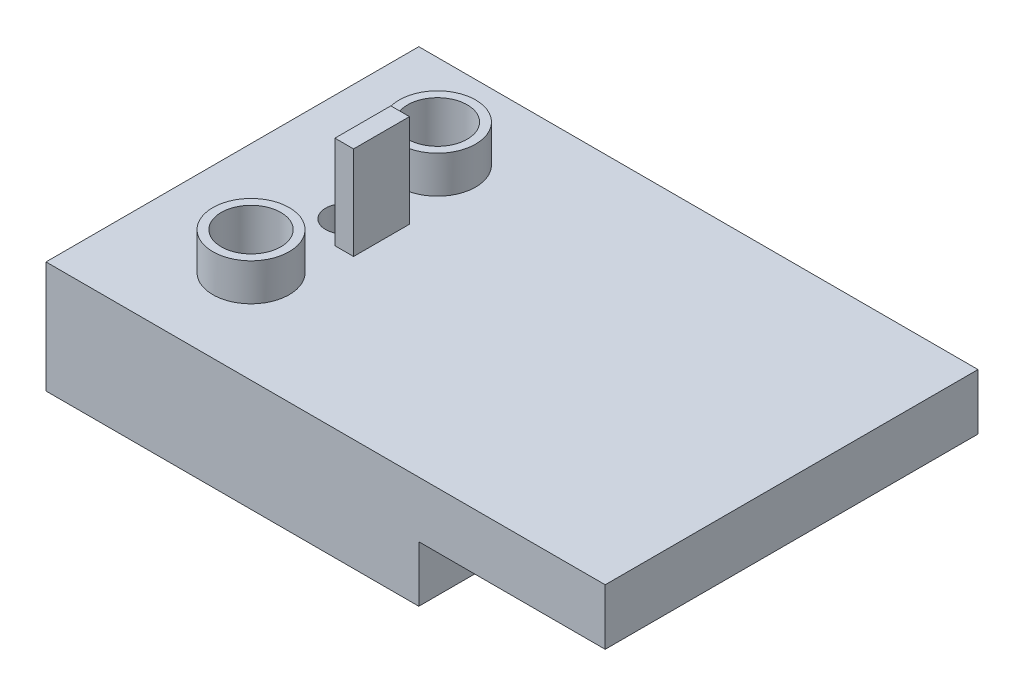
ISO-10303-21;
HEADER;
FILE_DESCRIPTION(('STEP AP214'),'2;1');
FILE_NAME('part.step','',(''),(''),'','','');
FILE_SCHEMA(('AUTOMOTIVE_DESIGN { 1 0 10303 214 1 1 1 1 }'));
ENDSEC;
DATA;
#1=APPLICATION_CONTEXT('core data for automotive mechanical design processes');
#2=APPLICATION_PROTOCOL_DEFINITION('international standard','automotive_design',2000,#1);
#3=PRODUCT_CONTEXT('',#1,'mechanical');
#4=PRODUCT('Part','Part','',(#3));
#5=PRODUCT_RELATED_PRODUCT_CATEGORY('part','',(#4));
#6=PRODUCT_DEFINITION_FORMATION('','',#4);
#7=PRODUCT_DEFINITION_CONTEXT('part definition',#1,'design');
#8=PRODUCT_DEFINITION('design','',#6,#7);
#9=PRODUCT_DEFINITION_SHAPE('','',#8);
#10=(LENGTH_UNIT() NAMED_UNIT(*) SI_UNIT(.MILLI.,.METRE.));
#11=(NAMED_UNIT(*) PLANE_ANGLE_UNIT() SI_UNIT($,.RADIAN.));
#12=(NAMED_UNIT(*) SI_UNIT($,.STERADIAN.) SOLID_ANGLE_UNIT());
#13=UNCERTAINTY_MEASURE_WITH_UNIT(LENGTH_MEASURE(1.E-05),#10,'distance_accuracy_value','');
#14=(GEOMETRIC_REPRESENTATION_CONTEXT(3) GLOBAL_UNCERTAINTY_ASSIGNED_CONTEXT((#13)) GLOBAL_UNIT_ASSIGNED_CONTEXT((#10,
#11,#12)) REPRESENTATION_CONTEXT('',''));
#15=CARTESIAN_POINT('',(0.,0.,0.));
#16=DIRECTION('',(0.,0.,1.));
#17=DIRECTION('',(1.,0.,0.));
#18=AXIS2_PLACEMENT_3D('',#15,#16,#17);
#19=CARTESIAN_POINT('',(0.,6.,0.));
#20=DIRECTION('',(0.,-1.,0.));
#21=DIRECTION('',(0.,0.,-1.));
#22=AXIS2_PLACEMENT_3D('',#19,#20,#21);
#23=PLANE('',#22);
#24=CARTESIAN_POINT('',(6.,6.,-5.));
#25=DIRECTION('',(0.,-1.,0.));
#26=DIRECTION('',(0.,0.,-1.));
#27=AXIS2_PLACEMENT_3D('',#24,#25,#26);
#28=CIRCLE('',#27,2.05);
#29=CARTESIAN_POINT('',(6.,6.,-7.05));
#30=VERTEX_POINT('',#29);
#31=EDGE_CURVE('E370',#30,#30,#28,.F.);
#32=ORIENTED_EDGE('',*,*,#31,.F.);
#33=EDGE_LOOP('',(#32));
#34=FACE_BOUND('',#33,.T.);
#35=DIRECTION('',(0.,0.,1.));
#36=VECTOR('',#35,1.);
#37=CARTESIAN_POINT('',(0.,6.,0.));
#38=LINE('',#37,#36);
#39=CARTESIAN_POINT('',(0.,6.,-20.));
#40=VERTEX_POINT('',#39);
#41=CARTESIAN_POINT('',(0.,6.,0.));
#42=VERTEX_POINT('',#41);
#43=EDGE_CURVE('E339',#40,#42,#38,.T.);
#44=ORIENTED_EDGE('',*,*,#43,.T.);
#45=DIRECTION('',(1.,0.,0.));
#46=VECTOR('',#45,1.);
#47=CARTESIAN_POINT('',(0.,6.,0.));
#48=LINE('',#47,#46);
#49=CARTESIAN_POINT('',(30.,6.,0.));
#50=VERTEX_POINT('',#49);
#51=EDGE_CURVE('E342',#42,#50,#48,.T.);
#52=ORIENTED_EDGE('',*,*,#51,.T.);
#53=DIRECTION('',(0.,0.,-1.));
#54=VECTOR('',#53,1.);
#55=CARTESIAN_POINT('',(30.,6.,0.));
#56=LINE('',#55,#54);
#57=CARTESIAN_POINT('',(30.,6.,-20.));
#58=VERTEX_POINT('',#57);
#59=EDGE_CURVE('E345',#50,#58,#56,.T.);
#60=ORIENTED_EDGE('',*,*,#59,.T.);
#61=DIRECTION('',(-1.,0.,0.));
#62=VECTOR('',#61,1.);
#63=CARTESIAN_POINT('',(0.,6.,-20.));
#64=LINE('',#63,#62);
#65=EDGE_CURVE('E347',#58,#40,#64,.T.);
#66=ORIENTED_EDGE('',*,*,#65,.T.);
#67=EDGE_LOOP('',(#44,#52,#60,#66));
#68=FACE_BOUND('',#67,.T.);
#69=CARTESIAN_POINT('',(6.,6.,-15.));
#70=DIRECTION('',(0.,-1.,0.));
#71=DIRECTION('',(0.,0.,-1.));
#72=AXIS2_PLACEMENT_3D('',#69,#70,#71);
#73=CIRCLE('',#72,2.05);
#74=CARTESIAN_POINT('',(6.,6.,-17.05));
#75=VERTEX_POINT('',#74);
#76=EDGE_CURVE('E367',#75,#75,#73,.F.);
#77=ORIENTED_EDGE('',*,*,#76,.F.);
#78=EDGE_LOOP('',(#77));
#79=FACE_BOUND('',#78,.T.);
#80=DIRECTION('',(0.,0.,1.));
#81=VECTOR('',#80,1.);
#82=CARTESIAN_POINT('',(7.,6.,-8.5));
#83=LINE('',#82,#81);
#84=CARTESIAN_POINT('',(7.,6.,-11.5));
#85=VERTEX_POINT('',#84);
#86=CARTESIAN_POINT('',(7.,6.,-10.));
#87=VERTEX_POINT('',#86);
#88=EDGE_CURVE('E742',#85,#87,#83,.T.);
#89=ORIENTED_EDGE('',*,*,#88,.F.);
#90=DIRECTION('',(-1.,0.,0.));
#91=VECTOR('',#90,1.);
#92=CARTESIAN_POINT('',(7.,6.,-11.5));
#93=LINE('',#92,#91);
#94=CARTESIAN_POINT('',(8.,6.,-11.5));
#95=VERTEX_POINT('',#94);
#96=EDGE_CURVE('E203',#95,#85,#93,.T.);
#97=ORIENTED_EDGE('',*,*,#96,.F.);
#98=DIRECTION('',(0.,0.,-1.));
#99=VECTOR('',#98,1.);
#100=CARTESIAN_POINT('',(8.,6.,-8.5));
#101=LINE('',#100,#99);
#102=CARTESIAN_POINT('',(8.,6.,-8.5));
#103=VERTEX_POINT('',#102);
#104=EDGE_CURVE('E54',#103,#95,#101,.T.);
#105=ORIENTED_EDGE('',*,*,#104,.F.);
#106=DIRECTION('',(1.,0.,0.));
#107=VECTOR('',#106,1.);
#108=CARTESIAN_POINT('',(7.,6.,-8.5));
#109=LINE('',#108,#107);
#110=CARTESIAN_POINT('',(7.,6.,-8.5));
#111=VERTEX_POINT('',#110);
#112=EDGE_CURVE('E49',#111,#103,#109,.T.);
#113=ORIENTED_EDGE('',*,*,#112,.F.);
#114=EDGE_CURVE('E207',#87,#111,#83,.T.);
#115=ORIENTED_EDGE('',*,*,#114,.F.);
#116=CARTESIAN_POINT('',(6.,6.,-10.));
#117=DIRECTION('',(0.,1.,0.));
#118=DIRECTION('',(0.,0.,1.));
#119=AXIS2_PLACEMENT_3D('',#116,#117,#118);
#120=CIRCLE('',#119,1.);
#121=EDGE_CURVE('E208',#87,#87,#120,.T.);
#122=ORIENTED_EDGE('',*,*,#121,.F.);
#123=EDGE_LOOP('',(#89,#97,#105,#113,#115,#122));
#124=FACE_BOUND('',#123,.T.);
#125=ADVANCED_FACE('F33',(#34,#68,#79,#124),#23,.F.);
#126=CARTESIAN_POINT('',(6.,-34.,-15.));
#127=DIRECTION('',(0.,1.,0.));
#128=DIRECTION('',(0.,0.,1.));
#129=AXIS2_PLACEMENT_3D('',#126,#127,#128);
#130=CYLINDRICAL_SURFACE('',#129,1.6);
#131=CARTESIAN_POINT('',(6.,8.,-15.));
#132=DIRECTION('',(0.,1.,0.));
#133=DIRECTION('',(0.,0.,1.));
#134=AXIS2_PLACEMENT_3D('',#131,#132,#133);
#135=CIRCLE('',#134,1.6);
#136=CARTESIAN_POINT('',(6.,8.,-13.4));
#137=VERTEX_POINT('',#136);
#138=EDGE_CURVE('E332',#137,#137,#135,.T.);
#139=ORIENTED_EDGE('',*,*,#138,.T.);
#140=EDGE_LOOP('',(#139));
#141=FACE_BOUND('',#140,.T.);
#142=CARTESIAN_POINT('',(6.,3.,-15.));
#143=DIRECTION('',(0.,-1.,0.));
#144=DIRECTION('',(0.,0.,-1.));
#145=AXIS2_PLACEMENT_3D('',#142,#143,#144);
#146=CIRCLE('',#145,1.6);
#147=CARTESIAN_POINT('',(6.,3.,-16.6));
#148=VERTEX_POINT('',#147);
#149=EDGE_CURVE('E329',#148,#148,#146,.F.);
#150=ORIENTED_EDGE('',*,*,#149,.F.);
#151=EDGE_LOOP('',(#150));
#152=FACE_BOUND('',#151,.T.);
#153=ADVANCED_FACE('F415',(#141,#152),#130,.F.);
#154=CARTESIAN_POINT('',(6.,-34.,-5.));
#155=DIRECTION('',(0.,1.,0.));
#156=DIRECTION('',(0.,0.,1.));
#157=AXIS2_PLACEMENT_3D('',#154,#155,#156);
#158=CYLINDRICAL_SURFACE('',#157,1.6);
#159=CARTESIAN_POINT('',(6.,8.,-5.));
#160=DIRECTION('',(0.,1.,0.));
#161=DIRECTION('',(0.,0.,1.));
#162=AXIS2_PLACEMENT_3D('',#159,#160,#161);
#163=CIRCLE('',#162,1.6);
#164=CARTESIAN_POINT('',(6.,8.,-3.4));
#165=VERTEX_POINT('',#164);
#166=EDGE_CURVE('E325',#165,#165,#163,.T.);
#167=ORIENTED_EDGE('',*,*,#166,.T.);
#168=EDGE_LOOP('',(#167));
#169=FACE_BOUND('',#168,.T.);
#170=CARTESIAN_POINT('',(6.,3.,-5.));
#171=DIRECTION('',(0.,-1.,0.));
#172=DIRECTION('',(0.,0.,-1.));
#173=AXIS2_PLACEMENT_3D('',#170,#171,#172);
#174=CIRCLE('',#173,1.6);
#175=CARTESIAN_POINT('',(6.,3.,-6.6));
#176=VERTEX_POINT('',#175);
#177=EDGE_CURVE('E268',#176,#176,#174,.F.);
#178=ORIENTED_EDGE('',*,*,#177,.F.);
#179=EDGE_LOOP('',(#178));
#180=FACE_BOUND('',#179,.T.);
#181=ADVANCED_FACE('F413',(#169,#180),#158,.F.);
#182=CARTESIAN_POINT('',(0.,6.,0.));
#183=DIRECTION('',(1.,0.,0.));
#184=DIRECTION('',(0.,0.,-1.));
#185=AXIS2_PLACEMENT_3D('',#182,#183,#184);
#186=PLANE('',#185);
#187=DIRECTION('',(0.,0.,1.));
#188=VECTOR('',#187,1.);
#189=CARTESIAN_POINT('',(0.,0.,0.));
#190=LINE('',#189,#188);
#191=CARTESIAN_POINT('',(0.,0.,-20.));
#192=VERTEX_POINT('',#191);
#193=CARTESIAN_POINT('',(0.,0.,0.));
#194=VERTEX_POINT('',#193);
#195=EDGE_CURVE('E338',#192,#194,#190,.T.);
#196=ORIENTED_EDGE('',*,*,#195,.T.);
#197=DIRECTION('',(0.,-1.,0.));
#198=VECTOR('',#197,1.);
#199=CARTESIAN_POINT('',(0.,6.,0.));
#200=LINE('',#199,#198);
#201=EDGE_CURVE('E364',#42,#194,#200,.T.);
#202=ORIENTED_EDGE('',*,*,#201,.F.);
#203=ORIENTED_EDGE('',*,*,#43,.F.);
#204=DIRECTION('',(0.,-1.,0.));
#205=VECTOR('',#204,1.);
#206=CARTESIAN_POINT('',(0.,6.,-20.));
#207=LINE('',#206,#205);
#208=EDGE_CURVE('E349',#40,#192,#207,.T.);
#209=ORIENTED_EDGE('',*,*,#208,.T.);
#210=EDGE_LOOP('',(#196,#202,#203,#209));
#211=FACE_BOUND('',#210,.T.);
#212=ADVANCED_FACE('F35',(#211),#186,.F.);
#213=CARTESIAN_POINT('',(0.,6.,0.));
#214=DIRECTION('',(0.,0.,-1.));
#215=DIRECTION('',(-1.,0.,0.));
#216=AXIS2_PLACEMENT_3D('',#213,#214,#215);
#217=PLANE('',#216);
#218=DIRECTION('',(1.,0.,0.));
#219=VECTOR('',#218,1.);
#220=CARTESIAN_POINT('',(0.,0.,0.));
#221=LINE('',#220,#219);
#222=CARTESIAN_POINT('',(20.,0.,0.));
#223=VERTEX_POINT('',#222);
#224=EDGE_CURVE('E352',#194,#223,#221,.T.);
#225=ORIENTED_EDGE('',*,*,#224,.T.);
#226=DIRECTION('',(0.,-1.,0.));
#227=VECTOR('',#226,1.);
#228=CARTESIAN_POINT('',(20.,0.,0.));
#229=LINE('',#228,#227);
#230=CARTESIAN_POINT('',(20.,3.,0.));
#231=VERTEX_POINT('',#230);
#232=EDGE_CURVE('E219',#231,#223,#229,.T.);
#233=ORIENTED_EDGE('',*,*,#232,.F.);
#234=DIRECTION('',(-1.,0.,0.));
#235=VECTOR('',#234,1.);
#236=CARTESIAN_POINT('',(30.,3.,0.));
#237=LINE('',#236,#235);
#238=CARTESIAN_POINT('',(30.,3.,0.));
#239=VERTEX_POINT('',#238);
#240=EDGE_CURVE('E216',#239,#231,#237,.T.);
#241=ORIENTED_EDGE('',*,*,#240,.F.);
#242=DIRECTION('',(0.,-1.,0.));
#243=VECTOR('',#242,1.);
#244=CARTESIAN_POINT('',(30.,6.,0.));
#245=LINE('',#244,#243);
#246=EDGE_CURVE('E361',#50,#239,#245,.T.);
#247=ORIENTED_EDGE('',*,*,#246,.F.);
#248=ORIENTED_EDGE('',*,*,#51,.F.);
#249=ORIENTED_EDGE('',*,*,#201,.T.);
#250=EDGE_LOOP('',(#225,#233,#241,#247,#248,#249));
#251=FACE_BOUND('',#250,.T.);
#252=ADVANCED_FACE('F406',(#251),#217,.F.);
#253=CARTESIAN_POINT('',(30.,6.,0.));
#254=DIRECTION('',(-1.,0.,0.));
#255=DIRECTION('',(0.,0.,1.));
#256=AXIS2_PLACEMENT_3D('',#253,#254,#255);
#257=PLANE('',#256);
#258=ORIENTED_EDGE('',*,*,#246,.T.);
#259=DIRECTION('',(0.,0.,1.));
#260=VECTOR('',#259,1.);
#261=CARTESIAN_POINT('',(30.,3.,-24.));
#262=LINE('',#261,#260);
#263=CARTESIAN_POINT('',(30.,3.,-20.));
#264=VERTEX_POINT('',#263);
#265=EDGE_CURVE('E221',#264,#239,#262,.T.);
#266=ORIENTED_EDGE('',*,*,#265,.F.);
#267=DIRECTION('',(0.,-1.,0.));
#268=VECTOR('',#267,1.);
#269=CARTESIAN_POINT('',(30.,6.,-20.));
#270=LINE('',#269,#268);
#271=EDGE_CURVE('E358',#58,#264,#270,.T.);
#272=ORIENTED_EDGE('',*,*,#271,.F.);
#273=ORIENTED_EDGE('',*,*,#59,.F.);
#274=EDGE_LOOP('',(#258,#266,#272,#273));
#275=FACE_BOUND('',#274,.T.);
#276=ADVANCED_FACE('F401',(#275),#257,.F.);
#277=CARTESIAN_POINT('',(0.,6.,-20.));
#278=DIRECTION('',(0.,0.,1.));
#279=DIRECTION('',(1.,0.,0.));
#280=AXIS2_PLACEMENT_3D('',#277,#278,#279);
#281=PLANE('',#280);
#282=DIRECTION('',(-1.,0.,0.));
#283=VECTOR('',#282,1.);
#284=CARTESIAN_POINT('',(0.,3.,-20.));
#285=LINE('',#284,#283);
#286=CARTESIAN_POINT('',(20.,3.,-20.));
#287=VERTEX_POINT('',#286);
#288=EDGE_CURVE('E11',#264,#287,#285,.T.);
#289=ORIENTED_EDGE('',*,*,#288,.T.);
#290=DIRECTION('',(0.,-1.,0.));
#291=VECTOR('',#290,1.);
#292=CARTESIAN_POINT('',(20.,6.,-20.));
#293=LINE('',#292,#291);
#294=CARTESIAN_POINT('',(20.,0.,-20.));
#295=VERTEX_POINT('',#294);
#296=EDGE_CURVE('E224',#287,#295,#293,.T.);
#297=ORIENTED_EDGE('',*,*,#296,.T.);
#298=DIRECTION('',(-1.,0.,0.));
#299=VECTOR('',#298,1.);
#300=CARTESIAN_POINT('',(0.,0.,-20.));
#301=LINE('',#300,#299);
#302=EDGE_CURVE('E343',#295,#192,#301,.T.);
#303=ORIENTED_EDGE('',*,*,#302,.T.);
#304=ORIENTED_EDGE('',*,*,#208,.F.);
#305=ORIENTED_EDGE('',*,*,#65,.F.);
#306=ORIENTED_EDGE('',*,*,#271,.T.);
#307=EDGE_LOOP('',(#289,#297,#303,#304,#305,#306));
#308=FACE_BOUND('',#307,.T.);
#309=ADVANCED_FACE('F385',(#308),#281,.F.);
#310=CARTESIAN_POINT('',(0.,0.,0.));
#311=DIRECTION('',(0.,-1.,0.));
#312=DIRECTION('',(0.,0.,-1.));
#313=AXIS2_PLACEMENT_3D('',#310,#311,#312);
#314=PLANE('',#313);
#315=CARTESIAN_POINT('',(6.,0.,-10.));
#316=DIRECTION('',(0.,-1.,0.));
#317=DIRECTION('',(0.,0.,-1.));
#318=AXIS2_PLACEMENT_3D('',#315,#316,#317);
#319=CIRCLE('',#318,1.);
#320=CARTESIAN_POINT('',(6.,0.,-11.));
#321=VERTEX_POINT('',#320);
#322=EDGE_CURVE('E37',#321,#321,#319,.T.);
#323=ORIENTED_EDGE('',*,*,#322,.F.);
#324=EDGE_LOOP('',(#323));
#325=FACE_BOUND('',#324,.T.);
#326=DIRECTION('',(0.,0.,-1.));
#327=VECTOR('',#326,1.);
#328=CARTESIAN_POINT('',(20.,0.,0.));
#329=LINE('',#328,#327);
#330=EDGE_CURVE('E42',#223,#295,#329,.T.);
#331=ORIENTED_EDGE('',*,*,#330,.F.);
#332=ORIENTED_EDGE('',*,*,#224,.F.);
#333=ORIENTED_EDGE('',*,*,#195,.F.);
#334=ORIENTED_EDGE('',*,*,#302,.F.);
#335=EDGE_LOOP('',(#331,#332,#333,#334));
#336=FACE_BOUND('',#335,.T.);
#337=DIRECTION('',(0.866025403784438,0.,0.5));
#338=VECTOR('',#337,1.);
#339=CARTESIAN_POINT('',(6.,0.,-8.46410161513776));
#340=LINE('',#339,#338);
#341=CARTESIAN_POINT('',(6.,0.,-8.46410161513776));
#342=VERTEX_POINT('',#341);
#343=CARTESIAN_POINT('',(9.,0.,-6.73205080756888));
#344=VERTEX_POINT('',#343);
#345=EDGE_CURVE('E249',#342,#344,#340,.T.);
#346=ORIENTED_EDGE('',*,*,#345,.F.);
#347=DIRECTION('',(0.866025403784439,0.,-0.5));
#348=VECTOR('',#347,1.);
#349=CARTESIAN_POINT('',(3.,0.,-6.73205080756888));
#350=LINE('',#349,#348);
#351=CARTESIAN_POINT('',(3.,0.,-6.73205080756888));
#352=VERTEX_POINT('',#351);
#353=EDGE_CURVE('E233',#352,#342,#350,.T.);
#354=ORIENTED_EDGE('',*,*,#353,.F.);
#355=DIRECTION('',(0.,0.,-1.));
#356=VECTOR('',#355,1.);
#357=CARTESIAN_POINT('',(3.,0.,-3.26794919243112));
#358=LINE('',#357,#356);
#359=CARTESIAN_POINT('',(3.,0.,-3.26794919243112));
#360=VERTEX_POINT('',#359);
#361=EDGE_CURVE('E261',#360,#352,#358,.T.);
#362=ORIENTED_EDGE('',*,*,#361,.F.);
#363=DIRECTION('',(-0.866025403784439,0.,-0.5));
#364=VECTOR('',#363,1.);
#365=CARTESIAN_POINT('',(6.,0.,-1.53589838486224));
#366=LINE('',#365,#364);
#367=CARTESIAN_POINT('',(6.,0.,-1.53589838486224));
#368=VERTEX_POINT('',#367);
#369=EDGE_CURVE('E258',#368,#360,#366,.T.);
#370=ORIENTED_EDGE('',*,*,#369,.F.);
#371=DIRECTION('',(-0.866025403784439,0.,0.5));
#372=VECTOR('',#371,1.);
#373=CARTESIAN_POINT('',(9.,0.,-3.26794919243112));
#374=LINE('',#373,#372);
#375=CARTESIAN_POINT('',(9.,0.,-3.26794919243112));
#376=VERTEX_POINT('',#375);
#377=EDGE_CURVE('E255',#376,#368,#374,.T.);
#378=ORIENTED_EDGE('',*,*,#377,.F.);
#379=DIRECTION('',(0.,0.,1.));
#380=VECTOR('',#379,1.);
#381=CARTESIAN_POINT('',(9.,0.,-6.73205080756888));
#382=LINE('',#381,#380);
#383=EDGE_CURVE('E251',#344,#376,#382,.T.);
#384=ORIENTED_EDGE('',*,*,#383,.F.);
#385=EDGE_LOOP('',(#346,#354,#362,#370,#378,#384));
#386=FACE_BOUND('',#385,.T.);
#387=DIRECTION('',(0.866025403784439,0.,0.5));
#388=VECTOR('',#387,1.);
#389=CARTESIAN_POINT('',(6.,0.,-18.4641016151378));
#390=LINE('',#389,#388);
#391=CARTESIAN_POINT('',(6.,0.,-18.4641016151378));
#392=VERTEX_POINT('',#391);
#393=CARTESIAN_POINT('',(9.,0.,-16.7320508075689));
#394=VERTEX_POINT('',#393);
#395=EDGE_CURVE('E228',#392,#394,#390,.T.);
#396=ORIENTED_EDGE('',*,*,#395,.F.);
#397=DIRECTION('',(0.866025403784439,0.,-0.5));
#398=VECTOR('',#397,1.);
#399=CARTESIAN_POINT('',(3.,0.,-16.7320508075689));
#400=LINE('',#399,#398);
#401=CARTESIAN_POINT('',(3.,0.,-16.7320508075689));
#402=VERTEX_POINT('',#401);
#403=EDGE_CURVE('E283',#402,#392,#400,.T.);
#404=ORIENTED_EDGE('',*,*,#403,.F.);
#405=DIRECTION('',(0.,0.,-1.));
#406=VECTOR('',#405,1.);
#407=CARTESIAN_POINT('',(3.,0.,-13.2679491924311));
#408=LINE('',#407,#406);
#409=CARTESIAN_POINT('',(3.,0.,-13.2679491924311));
#410=VERTEX_POINT('',#409);
#411=EDGE_CURVE('E309',#410,#402,#408,.T.);
#412=ORIENTED_EDGE('',*,*,#411,.F.);
#413=DIRECTION('',(-0.866025403784439,0.,-0.5));
#414=VECTOR('',#413,1.);
#415=CARTESIAN_POINT('',(6.,0.,-11.5358983848622));
#416=LINE('',#415,#414);
#417=CARTESIAN_POINT('',(6.,0.,-11.5358983848622));
#418=VERTEX_POINT('',#417);
#419=EDGE_CURVE('E306',#418,#410,#416,.T.);
#420=ORIENTED_EDGE('',*,*,#419,.F.);
#421=DIRECTION('',(-0.866025403784439,0.,0.5));
#422=VECTOR('',#421,1.);
#423=CARTESIAN_POINT('',(9.,0.,-13.2679491924311));
#424=LINE('',#423,#422);
#425=CARTESIAN_POINT('',(9.,0.,-13.2679491924311));
#426=VERTEX_POINT('',#425);
#427=EDGE_CURVE('E303',#426,#418,#424,.T.);
#428=ORIENTED_EDGE('',*,*,#427,.F.);
#429=DIRECTION('',(0.,0.,1.));
#430=VECTOR('',#429,1.);
#431=CARTESIAN_POINT('',(9.,0.,-16.7320508075689));
#432=LINE('',#431,#430);
#433=EDGE_CURVE('E300',#394,#426,#432,.T.);
#434=ORIENTED_EDGE('',*,*,#433,.F.);
#435=EDGE_LOOP('',(#396,#404,#412,#420,#428,#434));
#436=FACE_BOUND('',#435,.T.);
#437=ADVANCED_FACE('F388',(#325,#336,#386,#436),#314,.T.);
#438=CARTESIAN_POINT('',(6.,8.,-15.));
#439=DIRECTION('',(0.,1.,0.));
#440=DIRECTION('',(0.,0.,1.));
#441=AXIS2_PLACEMENT_3D('',#438,#439,#440);
#442=PLANE('',#441);
#443=CARTESIAN_POINT('',(6.,8.,-15.));
#444=DIRECTION('',(0.,1.,0.));
#445=DIRECTION('',(0.,0.,1.));
#446=AXIS2_PLACEMENT_3D('',#443,#444,#445);
#447=CIRCLE('',#446,2.05);
#448=CARTESIAN_POINT('',(6.,8.,-12.95));
#449=VERTEX_POINT('',#448);
#450=EDGE_CURVE('E335',#449,#449,#447,.T.);
#451=ORIENTED_EDGE('',*,*,#450,.T.);
#452=EDGE_LOOP('',(#451));
#453=FACE_BOUND('',#452,.T.);
#454=ORIENTED_EDGE('',*,*,#138,.F.);
#455=EDGE_LOOP('',(#454));
#456=FACE_BOUND('',#455,.T.);
#457=ADVANCED_FACE('F428',(#453,#456),#442,.T.);
#458=CARTESIAN_POINT('',(6.,8.,-15.));
#459=DIRECTION('',(0.,-1.,0.));
#460=DIRECTION('',(0.,0.,-1.));
#461=AXIS2_PLACEMENT_3D('',#458,#459,#460);
#462=CYLINDRICAL_SURFACE('',#461,2.05);
#463=ORIENTED_EDGE('',*,*,#450,.F.);
#464=EDGE_LOOP('',(#463));
#465=FACE_BOUND('',#464,.T.);
#466=ORIENTED_EDGE('',*,*,#76,.T.);
#467=EDGE_LOOP('',(#466));
#468=FACE_BOUND('',#467,.T.);
#469=ADVANCED_FACE('F447',(#465,#468),#462,.T.);
#470=CARTESIAN_POINT('',(6.,8.,-5.));
#471=DIRECTION('',(0.,1.,0.));
#472=DIRECTION('',(0.,0.,1.));
#473=AXIS2_PLACEMENT_3D('',#470,#471,#472);
#474=PLANE('',#473);
#475=CARTESIAN_POINT('',(6.,8.,-5.));
#476=DIRECTION('',(0.,1.,0.));
#477=DIRECTION('',(0.,0.,1.));
#478=AXIS2_PLACEMENT_3D('',#475,#476,#477);
#479=CIRCLE('',#478,2.05);
#480=CARTESIAN_POINT('',(6.,8.,-2.95));
#481=VERTEX_POINT('',#480);
#482=EDGE_CURVE('E328',#481,#481,#479,.T.);
#483=ORIENTED_EDGE('',*,*,#482,.T.);
#484=EDGE_LOOP('',(#483));
#485=FACE_BOUND('',#484,.T.);
#486=ORIENTED_EDGE('',*,*,#166,.F.);
#487=EDGE_LOOP('',(#486));
#488=FACE_BOUND('',#487,.T.);
#489=ADVANCED_FACE('F456',(#485,#488),#474,.T.);
#490=CARTESIAN_POINT('',(6.,8.,-5.));
#491=DIRECTION('',(0.,-1.,0.));
#492=DIRECTION('',(0.,0.,-1.));
#493=AXIS2_PLACEMENT_3D('',#490,#491,#492);
#494=CYLINDRICAL_SURFACE('',#493,2.05);
#495=ORIENTED_EDGE('',*,*,#482,.F.);
#496=EDGE_LOOP('',(#495));
#497=FACE_BOUND('',#496,.T.);
#498=ORIENTED_EDGE('',*,*,#31,.T.);
#499=EDGE_LOOP('',(#498));
#500=FACE_BOUND('',#499,.T.);
#501=ADVANCED_FACE('F464',(#497,#500),#494,.T.);
#502=CARTESIAN_POINT('',(0.,3.,0.));
#503=DIRECTION('',(0.,-1.,0.));
#504=DIRECTION('',(0.,0.,-1.));
#505=AXIS2_PLACEMENT_3D('',#502,#503,#504);
#506=PLANE('',#505);
#507=DIRECTION('',(0.866025403784438,0.,0.5));
#508=VECTOR('',#507,1.);
#509=CARTESIAN_POINT('',(6.,3.,-8.46410161513776));
#510=LINE('',#509,#508);
#511=CARTESIAN_POINT('',(6.,3.,-8.46410161513776));
#512=VERTEX_POINT('',#511);
#513=CARTESIAN_POINT('',(9.,3.,-6.73205080756888));
#514=VERTEX_POINT('',#513);
#515=EDGE_CURVE('E229',#512,#514,#510,.T.);
#516=ORIENTED_EDGE('',*,*,#515,.T.);
#517=DIRECTION('',(0.,0.,1.));
#518=VECTOR('',#517,1.);
#519=CARTESIAN_POINT('',(9.,3.,-6.73205080756888));
#520=LINE('',#519,#518);
#521=CARTESIAN_POINT('',(9.,3.,-3.26794919243112));
#522=VERTEX_POINT('',#521);
#523=EDGE_CURVE('E232',#514,#522,#520,.T.);
#524=ORIENTED_EDGE('',*,*,#523,.T.);
#525=DIRECTION('',(-0.866025403784439,0.,0.5));
#526=VECTOR('',#525,1.);
#527=CARTESIAN_POINT('',(9.,3.,-3.26794919243112));
#528=LINE('',#527,#526);
#529=CARTESIAN_POINT('',(6.,3.,-1.53589838486224));
#530=VERTEX_POINT('',#529);
#531=EDGE_CURVE('E236',#522,#530,#528,.T.);
#532=ORIENTED_EDGE('',*,*,#531,.T.);
#533=DIRECTION('',(-0.866025403784439,0.,-0.5));
#534=VECTOR('',#533,1.);
#535=CARTESIAN_POINT('',(6.,3.,-1.53589838486224));
#536=LINE('',#535,#534);
#537=CARTESIAN_POINT('',(3.,3.,-3.26794919243112));
#538=VERTEX_POINT('',#537);
#539=EDGE_CURVE('E239',#530,#538,#536,.T.);
#540=ORIENTED_EDGE('',*,*,#539,.T.);
#541=DIRECTION('',(0.,0.,-1.));
#542=VECTOR('',#541,1.);
#543=CARTESIAN_POINT('',(3.,3.,-3.26794919243112));
#544=LINE('',#543,#542);
#545=CARTESIAN_POINT('',(3.,3.,-6.73205080756888));
#546=VERTEX_POINT('',#545);
#547=EDGE_CURVE('E242',#538,#546,#544,.T.);
#548=ORIENTED_EDGE('',*,*,#547,.T.);
#549=DIRECTION('',(0.866025403784439,0.,-0.5));
#550=VECTOR('',#549,1.);
#551=CARTESIAN_POINT('',(3.,3.,-6.73205080756888));
#552=LINE('',#551,#550);
#553=EDGE_CURVE('E245',#546,#512,#552,.T.);
#554=ORIENTED_EDGE('',*,*,#553,.T.);
#555=EDGE_LOOP('',(#516,#524,#532,#540,#548,#554));
#556=FACE_BOUND('',#555,.T.);
#557=ORIENTED_EDGE('',*,*,#177,.T.);
#558=EDGE_LOOP('',(#557));
#559=FACE_BOUND('',#558,.T.);
#560=ADVANCED_FACE('F472',(#556,#559),#506,.T.);
#561=CARTESIAN_POINT('',(6.,3.,-8.46410161513776));
#562=DIRECTION('',(0.5,0.,-0.866025403784439));
#563=DIRECTION('',(-0.866025403784439,0.,-0.5));
#564=AXIS2_PLACEMENT_3D('',#561,#562,#563);
#565=PLANE('',#564);
#566=ORIENTED_EDGE('',*,*,#345,.T.);
#567=DIRECTION('',(0.,-1.,0.));
#568=VECTOR('',#567,1.);
#569=CARTESIAN_POINT('',(9.,3.,-6.73205080756888));
#570=LINE('',#569,#568);
#571=EDGE_CURVE('E248',#514,#344,#570,.T.);
#572=ORIENTED_EDGE('',*,*,#571,.F.);
#573=ORIENTED_EDGE('',*,*,#515,.F.);
#574=DIRECTION('',(0.,-1.,0.));
#575=VECTOR('',#574,1.);
#576=CARTESIAN_POINT('',(6.,3.,-8.46410161513776));
#577=LINE('',#576,#575);
#578=EDGE_CURVE('E266',#512,#342,#577,.T.);
#579=ORIENTED_EDGE('',*,*,#578,.T.);
#580=EDGE_LOOP('',(#566,#572,#573,#579));
#581=FACE_BOUND('',#580,.T.);
#582=ADVANCED_FACE('F481',(#581),#565,.F.);
#583=CARTESIAN_POINT('',(3.,3.,-6.73205080756888));
#584=DIRECTION('',(-0.5,0.,-0.866025403784438));
#585=DIRECTION('',(-0.866025403784439,0.,0.5));
#586=AXIS2_PLACEMENT_3D('',#583,#584,#585);
#587=PLANE('',#586);
#588=ORIENTED_EDGE('',*,*,#353,.T.);
#589=ORIENTED_EDGE('',*,*,#578,.F.);
#590=ORIENTED_EDGE('',*,*,#553,.F.);
#591=DIRECTION('',(0.,-1.,0.));
#592=VECTOR('',#591,1.);
#593=CARTESIAN_POINT('',(3.,3.,-6.73205080756888));
#594=LINE('',#593,#592);
#595=EDGE_CURVE('E269',#546,#352,#594,.T.);
#596=ORIENTED_EDGE('',*,*,#595,.T.);
#597=EDGE_LOOP('',(#588,#589,#590,#596));
#598=FACE_BOUND('',#597,.T.);
#599=ADVANCED_FACE('F490',(#598),#587,.F.);
#600=CARTESIAN_POINT('',(3.,3.,-3.26794919243112));
#601=DIRECTION('',(-1.,0.,0.));
#602=DIRECTION('',(0.,0.,1.));
#603=AXIS2_PLACEMENT_3D('',#600,#601,#602);
#604=PLANE('',#603);
#605=ORIENTED_EDGE('',*,*,#361,.T.);
#606=ORIENTED_EDGE('',*,*,#595,.F.);
#607=ORIENTED_EDGE('',*,*,#547,.F.);
#608=DIRECTION('',(0.,-1.,0.));
#609=VECTOR('',#608,1.);
#610=CARTESIAN_POINT('',(3.,3.,-3.26794919243112));
#611=LINE('',#610,#609);
#612=EDGE_CURVE('E271',#538,#360,#611,.T.);
#613=ORIENTED_EDGE('',*,*,#612,.T.);
#614=EDGE_LOOP('',(#605,#606,#607,#613));
#615=FACE_BOUND('',#614,.T.);
#616=ADVANCED_FACE('F498',(#615),#604,.F.);
#617=CARTESIAN_POINT('',(6.,3.,-1.53589838486224));
#618=DIRECTION('',(-0.5,0.,0.866025403784439));
#619=DIRECTION('',(0.866025403784439,0.,0.5));
#620=AXIS2_PLACEMENT_3D('',#617,#618,#619);
#621=PLANE('',#620);
#622=ORIENTED_EDGE('',*,*,#369,.T.);
#623=ORIENTED_EDGE('',*,*,#612,.F.);
#624=ORIENTED_EDGE('',*,*,#539,.F.);
#625=DIRECTION('',(0.,-1.,0.));
#626=VECTOR('',#625,1.);
#627=CARTESIAN_POINT('',(6.,3.,-1.53589838486224));
#628=LINE('',#627,#626);
#629=EDGE_CURVE('E273',#530,#368,#628,.T.);
#630=ORIENTED_EDGE('',*,*,#629,.T.);
#631=EDGE_LOOP('',(#622,#623,#624,#630));
#632=FACE_BOUND('',#631,.T.);
#633=ADVANCED_FACE('F506',(#632),#621,.F.);
#634=CARTESIAN_POINT('',(9.,3.,-3.26794919243112));
#635=DIRECTION('',(0.5,0.,0.866025403784439));
#636=DIRECTION('',(0.866025403784439,0.,-0.5));
#637=AXIS2_PLACEMENT_3D('',#634,#635,#636);
#638=PLANE('',#637);
#639=ORIENTED_EDGE('',*,*,#377,.T.);
#640=ORIENTED_EDGE('',*,*,#629,.F.);
#641=ORIENTED_EDGE('',*,*,#531,.F.);
#642=DIRECTION('',(0.,-1.,0.));
#643=VECTOR('',#642,1.);
#644=CARTESIAN_POINT('',(9.,3.,-3.26794919243112));
#645=LINE('',#644,#643);
#646=EDGE_CURVE('E275',#522,#376,#645,.T.);
#647=ORIENTED_EDGE('',*,*,#646,.T.);
#648=EDGE_LOOP('',(#639,#640,#641,#647));
#649=FACE_BOUND('',#648,.T.);
#650=ADVANCED_FACE('F514',(#649),#638,.F.);
#651=CARTESIAN_POINT('',(9.,3.,-6.73205080756888));
#652=DIRECTION('',(1.,0.,0.));
#653=DIRECTION('',(0.,0.,-1.));
#654=AXIS2_PLACEMENT_3D('',#651,#652,#653);
#655=PLANE('',#654);
#656=ORIENTED_EDGE('',*,*,#383,.T.);
#657=ORIENTED_EDGE('',*,*,#646,.F.);
#658=ORIENTED_EDGE('',*,*,#523,.F.);
#659=ORIENTED_EDGE('',*,*,#571,.T.);
#660=EDGE_LOOP('',(#656,#657,#658,#659));
#661=FACE_BOUND('',#660,.T.);
#662=ADVANCED_FACE('F522',(#661),#655,.F.);
#663=CARTESIAN_POINT('',(0.,3.,0.));
#664=DIRECTION('',(0.,-1.,0.));
#665=DIRECTION('',(0.,0.,-1.));
#666=AXIS2_PLACEMENT_3D('',#663,#664,#665);
#667=PLANE('',#666);
#668=DIRECTION('',(0.866025403784439,0.,0.5));
#669=VECTOR('',#668,1.);
#670=CARTESIAN_POINT('',(6.,3.,-18.4641016151378));
#671=LINE('',#670,#669);
#672=CARTESIAN_POINT('',(6.,3.,-18.4641016151378));
#673=VERTEX_POINT('',#672);
#674=CARTESIAN_POINT('',(9.,3.,-16.7320508075689));
#675=VERTEX_POINT('',#674);
#676=EDGE_CURVE('E279',#673,#675,#671,.T.);
#677=ORIENTED_EDGE('',*,*,#676,.T.);
#678=DIRECTION('',(0.,0.,1.));
#679=VECTOR('',#678,1.);
#680=CARTESIAN_POINT('',(9.,3.,-16.7320508075689));
#681=LINE('',#680,#679);
#682=CARTESIAN_POINT('',(9.,3.,-13.2679491924311));
#683=VERTEX_POINT('',#682);
#684=EDGE_CURVE('E282',#675,#683,#681,.T.);
#685=ORIENTED_EDGE('',*,*,#684,.T.);
#686=DIRECTION('',(-0.866025403784439,0.,0.5));
#687=VECTOR('',#686,1.);
#688=CARTESIAN_POINT('',(9.,3.,-13.2679491924311));
#689=LINE('',#688,#687);
#690=CARTESIAN_POINT('',(6.,3.,-11.5358983848622));
#691=VERTEX_POINT('',#690);
#692=EDGE_CURVE('E286',#683,#691,#689,.T.);
#693=ORIENTED_EDGE('',*,*,#692,.T.);
#694=DIRECTION('',(-0.866025403784439,0.,-0.5));
#695=VECTOR('',#694,1.);
#696=CARTESIAN_POINT('',(6.,3.,-11.5358983848622));
#697=LINE('',#696,#695);
#698=CARTESIAN_POINT('',(3.,3.,-13.2679491924311));
#699=VERTEX_POINT('',#698);
#700=EDGE_CURVE('E289',#691,#699,#697,.T.);
#701=ORIENTED_EDGE('',*,*,#700,.T.);
#702=DIRECTION('',(0.,0.,-1.));
#703=VECTOR('',#702,1.);
#704=CARTESIAN_POINT('',(3.,3.,-13.2679491924311));
#705=LINE('',#704,#703);
#706=CARTESIAN_POINT('',(3.,3.,-16.7320508075689));
#707=VERTEX_POINT('',#706);
#708=EDGE_CURVE('E292',#699,#707,#705,.T.);
#709=ORIENTED_EDGE('',*,*,#708,.T.);
#710=DIRECTION('',(0.866025403784439,0.,-0.5));
#711=VECTOR('',#710,1.);
#712=CARTESIAN_POINT('',(3.,3.,-16.7320508075689));
#713=LINE('',#712,#711);
#714=EDGE_CURVE('E295',#707,#673,#713,.T.);
#715=ORIENTED_EDGE('',*,*,#714,.T.);
#716=EDGE_LOOP('',(#677,#685,#693,#701,#709,#715));
#717=FACE_BOUND('',#716,.T.);
#718=ORIENTED_EDGE('',*,*,#149,.T.);
#719=EDGE_LOOP('',(#718));
#720=FACE_BOUND('',#719,.T.);
#721=ADVANCED_FACE('F530',(#717,#720),#667,.T.);
#722=CARTESIAN_POINT('',(6.,3.,-18.4641016151378));
#723=DIRECTION('',(0.5,0.,-0.866025403784439));
#724=DIRECTION('',(-0.866025403784439,0.,-0.5));
#725=AXIS2_PLACEMENT_3D('',#722,#723,#724);
#726=PLANE('',#725);
#727=ORIENTED_EDGE('',*,*,#395,.T.);
#728=DIRECTION('',(0.,-1.,0.));
#729=VECTOR('',#728,1.);
#730=CARTESIAN_POINT('',(9.,3.,-16.7320508075689));
#731=LINE('',#730,#729);
#732=EDGE_CURVE('E298',#675,#394,#731,.T.);
#733=ORIENTED_EDGE('',*,*,#732,.F.);
#734=ORIENTED_EDGE('',*,*,#676,.F.);
#735=DIRECTION('',(0.,-1.,0.));
#736=VECTOR('',#735,1.);
#737=CARTESIAN_POINT('',(6.,3.,-18.4641016151378));
#738=LINE('',#737,#736);
#739=EDGE_CURVE('E252',#673,#392,#738,.T.);
#740=ORIENTED_EDGE('',*,*,#739,.T.);
#741=EDGE_LOOP('',(#727,#733,#734,#740));
#742=FACE_BOUND('',#741,.T.);
#743=ADVANCED_FACE('F538',(#742),#726,.F.);
#744=CARTESIAN_POINT('',(3.,3.,-16.7320508075689));
#745=DIRECTION('',(-0.5,0.,-0.866025403784438));
#746=DIRECTION('',(-0.866025403784439,0.,0.5));
#747=AXIS2_PLACEMENT_3D('',#744,#745,#746);
#748=PLANE('',#747);
#749=ORIENTED_EDGE('',*,*,#403,.T.);
#750=ORIENTED_EDGE('',*,*,#739,.F.);
#751=ORIENTED_EDGE('',*,*,#714,.F.);
#752=DIRECTION('',(0.,-1.,0.));
#753=VECTOR('',#752,1.);
#754=CARTESIAN_POINT('',(3.,3.,-16.7320508075689));
#755=LINE('',#754,#753);
#756=EDGE_CURVE('E315',#707,#402,#755,.T.);
#757=ORIENTED_EDGE('',*,*,#756,.T.);
#758=EDGE_LOOP('',(#749,#750,#751,#757));
#759=FACE_BOUND('',#758,.T.);
#760=ADVANCED_FACE('F546',(#759),#748,.F.);
#761=CARTESIAN_POINT('',(3.,3.,-13.2679491924311));
#762=DIRECTION('',(-1.,0.,0.));
#763=DIRECTION('',(0.,0.,1.));
#764=AXIS2_PLACEMENT_3D('',#761,#762,#763);
#765=PLANE('',#764);
#766=ORIENTED_EDGE('',*,*,#411,.T.);
#767=ORIENTED_EDGE('',*,*,#756,.F.);
#768=ORIENTED_EDGE('',*,*,#708,.F.);
#769=DIRECTION('',(0.,-1.,0.));
#770=VECTOR('',#769,1.);
#771=CARTESIAN_POINT('',(3.,3.,-13.2679491924311));
#772=LINE('',#771,#770);
#773=EDGE_CURVE('E317',#699,#410,#772,.T.);
#774=ORIENTED_EDGE('',*,*,#773,.T.);
#775=EDGE_LOOP('',(#766,#767,#768,#774));
#776=FACE_BOUND('',#775,.T.);
#777=ADVANCED_FACE('F554',(#776),#765,.F.);
#778=CARTESIAN_POINT('',(6.,3.,-11.5358983848622));
#779=DIRECTION('',(-0.5,0.,0.866025403784439));
#780=DIRECTION('',(0.866025403784439,0.,0.5));
#781=AXIS2_PLACEMENT_3D('',#778,#779,#780);
#782=PLANE('',#781);
#783=ORIENTED_EDGE('',*,*,#419,.T.);
#784=ORIENTED_EDGE('',*,*,#773,.F.);
#785=ORIENTED_EDGE('',*,*,#700,.F.);
#786=DIRECTION('',(0.,-1.,0.));
#787=VECTOR('',#786,1.);
#788=CARTESIAN_POINT('',(6.,3.,-11.5358983848622));
#789=LINE('',#788,#787);
#790=EDGE_CURVE('E319',#691,#418,#789,.T.);
#791=ORIENTED_EDGE('',*,*,#790,.T.);
#792=EDGE_LOOP('',(#783,#784,#785,#791));
#793=FACE_BOUND('',#792,.T.);
#794=ADVANCED_FACE('F562',(#793),#782,.F.);
#795=CARTESIAN_POINT('',(9.,3.,-13.2679491924311));
#796=DIRECTION('',(0.5,0.,0.866025403784439));
#797=DIRECTION('',(0.866025403784439,0.,-0.5));
#798=AXIS2_PLACEMENT_3D('',#795,#796,#797);
#799=PLANE('',#798);
#800=ORIENTED_EDGE('',*,*,#427,.T.);
#801=ORIENTED_EDGE('',*,*,#790,.F.);
#802=ORIENTED_EDGE('',*,*,#692,.F.);
#803=DIRECTION('',(0.,-1.,0.));
#804=VECTOR('',#803,1.);
#805=CARTESIAN_POINT('',(9.,3.,-13.2679491924311));
#806=LINE('',#805,#804);
#807=EDGE_CURVE('E321',#683,#426,#806,.T.);
#808=ORIENTED_EDGE('',*,*,#807,.T.);
#809=EDGE_LOOP('',(#800,#801,#802,#808));
#810=FACE_BOUND('',#809,.T.);
#811=ADVANCED_FACE('F570',(#810),#799,.F.);
#812=CARTESIAN_POINT('',(9.,3.,-16.7320508075689));
#813=DIRECTION('',(1.,0.,0.));
#814=DIRECTION('',(0.,0.,-1.));
#815=AXIS2_PLACEMENT_3D('',#812,#813,#814);
#816=PLANE('',#815);
#817=ORIENTED_EDGE('',*,*,#433,.T.);
#818=ORIENTED_EDGE('',*,*,#807,.F.);
#819=ORIENTED_EDGE('',*,*,#684,.F.);
#820=ORIENTED_EDGE('',*,*,#732,.T.);
#821=EDGE_LOOP('',(#817,#818,#819,#820));
#822=FACE_BOUND('',#821,.T.);
#823=ADVANCED_FACE('F578',(#822),#816,.F.);
#824=CARTESIAN_POINT('',(30.,3.,-24.));
#825=DIRECTION('',(0.,1.,0.));
#826=DIRECTION('',(-1.,0.,0.));
#827=AXIS2_PLACEMENT_3D('',#824,#825,#826);
#828=PLANE('',#827);
#829=ORIENTED_EDGE('',*,*,#265,.T.);
#830=ORIENTED_EDGE('',*,*,#240,.T.);
#831=DIRECTION('',(0.,0.,1.));
#832=VECTOR('',#831,1.);
#833=CARTESIAN_POINT('',(20.,3.,-24.));
#834=LINE('',#833,#832);
#835=EDGE_CURVE('E222',#287,#231,#834,.T.);
#836=ORIENTED_EDGE('',*,*,#835,.F.);
#837=ORIENTED_EDGE('',*,*,#288,.F.);
#838=EDGE_LOOP('',(#829,#830,#836,#837));
#839=FACE_BOUND('',#838,.T.);
#840=ADVANCED_FACE('F404',(#839),#828,.F.);
#841=CARTESIAN_POINT('',(20.,0.,-24.));
#842=DIRECTION('',(-1.,0.,0.));
#843=DIRECTION('',(0.,0.,1.));
#844=AXIS2_PLACEMENT_3D('',#841,#842,#843);
#845=PLANE('',#844);
#846=ORIENTED_EDGE('',*,*,#835,.T.);
#847=ORIENTED_EDGE('',*,*,#232,.T.);
#848=ORIENTED_EDGE('',*,*,#330,.T.);
#849=ORIENTED_EDGE('',*,*,#296,.F.);
#850=EDGE_LOOP('',(#846,#847,#848,#849));
#851=FACE_BOUND('',#850,.T.);
#852=ADVANCED_FACE('F379',(#851),#845,.F.);
#853=CARTESIAN_POINT('',(6.,-18.,-10.));
#854=DIRECTION('',(0.,1.,0.));
#855=DIRECTION('',(0.,0.,1.));
#856=AXIS2_PLACEMENT_3D('',#853,#854,#855);
#857=CYLINDRICAL_SURFACE('',#856,1.);
#858=ORIENTED_EDGE('',*,*,#322,.T.);
#859=EDGE_LOOP('',(#858));
#860=FACE_BOUND('',#859,.T.);
#861=ORIENTED_EDGE('',*,*,#121,.T.);
#862=EDGE_LOOP('',(#861));
#863=FACE_BOUND('',#862,.T.);
#864=ADVANCED_FACE('F597',(#860,#863),#857,.F.);
#865=CARTESIAN_POINT('',(7.,11.,-8.5));
#866=DIRECTION('',(1.,0.,0.));
#867=DIRECTION('',(0.,0.,-1.));
#868=AXIS2_PLACEMENT_3D('',#865,#866,#867);
#869=PLANE('',#868);
#870=ORIENTED_EDGE('',*,*,#88,.T.);
#871=ORIENTED_EDGE('',*,*,#114,.T.);
#872=DIRECTION('',(0.,-1.,0.));
#873=VECTOR('',#872,1.);
#874=CARTESIAN_POINT('',(7.,11.,-8.5));
#875=LINE('',#874,#873);
#876=CARTESIAN_POINT('',(7.,11.,-8.5));
#877=VERTEX_POINT('',#876);
#878=EDGE_CURVE('E188',#877,#111,#875,.T.);
#879=ORIENTED_EDGE('',*,*,#878,.F.);
#880=DIRECTION('',(0.,0.,1.));
#881=VECTOR('',#880,1.);
#882=CARTESIAN_POINT('',(7.,11.,-8.5));
#883=LINE('',#882,#881);
#884=CARTESIAN_POINT('',(7.,11.,-11.5));
#885=VERTEX_POINT('',#884);
#886=EDGE_CURVE('E194',#885,#877,#883,.T.);
#887=ORIENTED_EDGE('',*,*,#886,.F.);
#888=DIRECTION('',(0.,-1.,0.));
#889=VECTOR('',#888,1.);
#890=CARTESIAN_POINT('',(7.,11.,-11.5));
#891=LINE('',#890,#889);
#892=EDGE_CURVE('E739',#885,#85,#891,.T.);
#893=ORIENTED_EDGE('',*,*,#892,.T.);
#894=EDGE_LOOP('',(#870,#871,#879,#887,#893));
#895=FACE_BOUND('',#894,.T.);
#896=ADVANCED_FACE('F206',(#895),#869,.F.);
#897=CARTESIAN_POINT('',(7.,11.,-8.5));
#898=DIRECTION('',(0.,0.,-1.));
#899=DIRECTION('',(-1.,0.,0.));
#900=AXIS2_PLACEMENT_3D('',#897,#898,#899);
#901=PLANE('',#900);
#902=ORIENTED_EDGE('',*,*,#112,.T.);
#903=DIRECTION('',(0.,-1.,0.));
#904=VECTOR('',#903,1.);
#905=CARTESIAN_POINT('',(8.,11.,-8.5));
#906=LINE('',#905,#904);
#907=CARTESIAN_POINT('',(8.,11.,-8.5));
#908=VERTEX_POINT('',#907);
#909=EDGE_CURVE('E190',#908,#103,#906,.T.);
#910=ORIENTED_EDGE('',*,*,#909,.F.);
#911=DIRECTION('',(1.,0.,0.));
#912=VECTOR('',#911,1.);
#913=CARTESIAN_POINT('',(7.,11.,-8.5));
#914=LINE('',#913,#912);
#915=EDGE_CURVE('E184',#877,#908,#914,.T.);
#916=ORIENTED_EDGE('',*,*,#915,.F.);
#917=ORIENTED_EDGE('',*,*,#878,.T.);
#918=EDGE_LOOP('',(#902,#910,#916,#917));
#919=FACE_BOUND('',#918,.T.);
#920=ADVANCED_FACE('F186',(#919),#901,.F.);
#921=CARTESIAN_POINT('',(8.,11.,-8.5));
#922=DIRECTION('',(-1.,0.,0.));
#923=DIRECTION('',(0.,0.,1.));
#924=AXIS2_PLACEMENT_3D('',#921,#922,#923);
#925=PLANE('',#924);
#926=ORIENTED_EDGE('',*,*,#104,.T.);
#927=DIRECTION('',(0.,-1.,0.));
#928=VECTOR('',#927,1.);
#929=CARTESIAN_POINT('',(8.,11.,-11.5));
#930=LINE('',#929,#928);
#931=CARTESIAN_POINT('',(8.,11.,-11.5));
#932=VERTEX_POINT('',#931);
#933=EDGE_CURVE('E212',#932,#95,#930,.T.);
#934=ORIENTED_EDGE('',*,*,#933,.F.);
#935=DIRECTION('',(0.,0.,-1.));
#936=VECTOR('',#935,1.);
#937=CARTESIAN_POINT('',(8.,11.,-8.5));
#938=LINE('',#937,#936);
#939=EDGE_CURVE('E193',#908,#932,#938,.T.);
#940=ORIENTED_EDGE('',*,*,#939,.F.);
#941=ORIENTED_EDGE('',*,*,#909,.T.);
#942=EDGE_LOOP('',(#926,#934,#940,#941));
#943=FACE_BOUND('',#942,.T.);
#944=ADVANCED_FACE('F617',(#943),#925,.F.);
#945=CARTESIAN_POINT('',(7.,11.,-11.5));
#946=DIRECTION('',(0.,0.,1.));
#947=DIRECTION('',(1.,0.,0.));
#948=AXIS2_PLACEMENT_3D('',#945,#946,#947);
#949=PLANE('',#948);
#950=ORIENTED_EDGE('',*,*,#96,.T.);
#951=ORIENTED_EDGE('',*,*,#892,.F.);
#952=DIRECTION('',(-1.,0.,0.));
#953=VECTOR('',#952,1.);
#954=CARTESIAN_POINT('',(7.,11.,-11.5));
#955=LINE('',#954,#953);
#956=EDGE_CURVE('E199',#932,#885,#955,.T.);
#957=ORIENTED_EDGE('',*,*,#956,.F.);
#958=ORIENTED_EDGE('',*,*,#933,.T.);
#959=EDGE_LOOP('',(#950,#951,#957,#958));
#960=FACE_BOUND('',#959,.T.);
#961=ADVANCED_FACE('F624',(#960),#949,.F.);
#962=CARTESIAN_POINT('',(0.,11.,0.));
#963=DIRECTION('',(0.,-1.,0.));
#964=DIRECTION('',(0.,0.,-1.));
#965=AXIS2_PLACEMENT_3D('',#962,#963,#964);
#966=PLANE('',#965);
#967=ORIENTED_EDGE('',*,*,#886,.T.);
#968=ORIENTED_EDGE('',*,*,#915,.T.);
#969=ORIENTED_EDGE('',*,*,#939,.T.);
#970=ORIENTED_EDGE('',*,*,#956,.T.);
#971=EDGE_LOOP('',(#967,#968,#969,#970));
#972=FACE_BOUND('',#971,.T.);
#973=ADVANCED_FACE('F197',(#972),#966,.F.);
#974=CLOSED_SHELL('',(#125,#153,#181,#212,#252,#276,#309,#437,#457,#469,#489,#501,#560,#582,
#599,#616,#633,#650,#662,#721,#743,#760,#777,#794,#811,#823,#840,#852,#864,#896,#920,#944,#961,#973));
#975=MANIFOLD_SOLID_BREP('B2',#974);
#976=ADVANCED_BREP_SHAPE_REPRESENTATION('',(#18,#975),#14);
#977=SHAPE_DEFINITION_REPRESENTATION(#9,#976);
ENDSEC;
END-ISO-10303-21;
